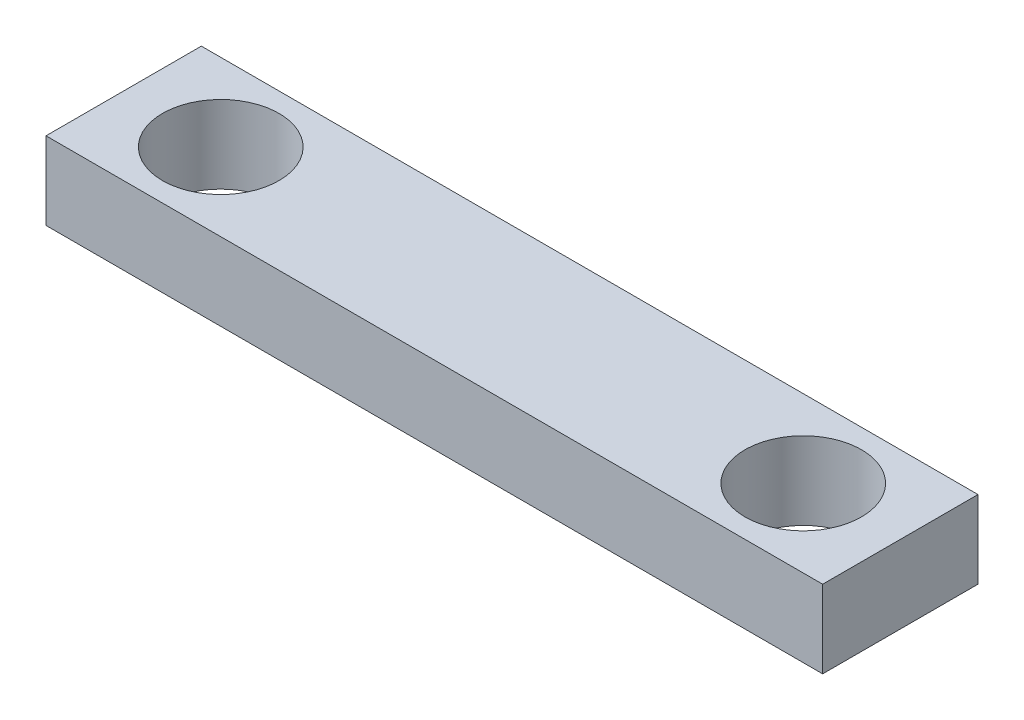
ISO-10303-21;
HEADER;
FILE_DESCRIPTION(('STEP AP214'),'2;1');
FILE_NAME('part.step','',(''),(''),'','','');
FILE_SCHEMA(('AUTOMOTIVE_DESIGN { 1 0 10303 214 1 1 1 1 }'));
ENDSEC;
DATA;
#1=APPLICATION_CONTEXT('core data for automotive mechanical design processes');
#2=APPLICATION_PROTOCOL_DEFINITION('international standard','automotive_design',2000,#1);
#3=PRODUCT_CONTEXT('',#1,'mechanical');
#4=PRODUCT('Part','Part','',(#3));
#5=PRODUCT_RELATED_PRODUCT_CATEGORY('part','',(#4));
#6=PRODUCT_DEFINITION_FORMATION('','',#4);
#7=PRODUCT_DEFINITION_CONTEXT('part definition',#1,'design');
#8=PRODUCT_DEFINITION('design','',#6,#7);
#9=PRODUCT_DEFINITION_SHAPE('','',#8);
#10=(LENGTH_UNIT() NAMED_UNIT(*) SI_UNIT(.MILLI.,.METRE.));
#11=(NAMED_UNIT(*) PLANE_ANGLE_UNIT() SI_UNIT($,.RADIAN.));
#12=(NAMED_UNIT(*) SI_UNIT($,.STERADIAN.) SOLID_ANGLE_UNIT());
#13=UNCERTAINTY_MEASURE_WITH_UNIT(LENGTH_MEASURE(1.E-05),#10,'distance_accuracy_value','');
#14=(GEOMETRIC_REPRESENTATION_CONTEXT(3) GLOBAL_UNCERTAINTY_ASSIGNED_CONTEXT((#13)) GLOBAL_UNIT_ASSIGNED_CONTEXT((#10,
#11,#12)) REPRESENTATION_CONTEXT('',''));
#15=CARTESIAN_POINT('',(0.,0.,0.));
#16=DIRECTION('',(0.,0.,1.));
#17=DIRECTION('',(1.,0.,0.));
#18=AXIS2_PLACEMENT_3D('',#15,#16,#17);
#19=CARTESIAN_POINT('',(0.,2.,0.));
#20=DIRECTION('',(0.,-1.,0.));
#21=DIRECTION('',(0.,0.,-1.));
#22=AXIS2_PLACEMENT_3D('',#19,#20,#21);
#23=PLANE('',#22);
#24=CARTESIAN_POINT('',(-7.5,2.,0.));
#25=DIRECTION('',(0.,1.,0.));
#26=DIRECTION('',(0.,0.,1.));
#27=AXIS2_PLACEMENT_3D('',#24,#25,#26);
#28=CIRCLE('',#27,1.5);
#29=CARTESIAN_POINT('',(-7.5,2.,1.5));
#30=VERTEX_POINT('',#29);
#31=EDGE_CURVE('E102',#30,#30,#28,.T.);
#32=ORIENTED_EDGE('',*,*,#31,.F.);
#33=EDGE_LOOP('',(#32));
#34=FACE_BOUND('',#33,.T.);
#35=DIRECTION('',(0.,0.,-1.));
#36=VECTOR('',#35,1.);
#37=CARTESIAN_POINT('',(10.,2.,2.));
#38=LINE('',#37,#36);
#39=CARTESIAN_POINT('',(10.,2.,2.));
#40=VERTEX_POINT('',#39);
#41=CARTESIAN_POINT('',(10.,2.,-2.));
#42=VERTEX_POINT('',#41);
#43=EDGE_CURVE('E87',#40,#42,#38,.T.);
#44=ORIENTED_EDGE('',*,*,#43,.T.);
#45=DIRECTION('',(-1.,0.,0.));
#46=VECTOR('',#45,1.);
#47=CARTESIAN_POINT('',(-10.,2.,-2.));
#48=LINE('',#47,#46);
#49=CARTESIAN_POINT('',(-10.,2.,-2.));
#50=VERTEX_POINT('',#49);
#51=EDGE_CURVE('E82',#42,#50,#48,.T.);
#52=ORIENTED_EDGE('',*,*,#51,.T.);
#53=DIRECTION('',(0.,0.,1.));
#54=VECTOR('',#53,1.);
#55=CARTESIAN_POINT('',(-10.,2.,2.));
#56=LINE('',#55,#54);
#57=CARTESIAN_POINT('',(-10.,2.,2.));
#58=VERTEX_POINT('',#57);
#59=EDGE_CURVE('E85',#50,#58,#56,.T.);
#60=ORIENTED_EDGE('',*,*,#59,.T.);
#61=DIRECTION('',(1.,0.,0.));
#62=VECTOR('',#61,1.);
#63=CARTESIAN_POINT('',(-10.,2.,2.));
#64=LINE('',#63,#62);
#65=EDGE_CURVE('E52',#58,#40,#64,.T.);
#66=ORIENTED_EDGE('',*,*,#65,.T.);
#67=EDGE_LOOP('',(#44,#52,#60,#66));
#68=FACE_BOUND('',#67,.T.);
#69=CARTESIAN_POINT('',(7.5,2.,0.));
#70=DIRECTION('',(0.,1.,0.));
#71=DIRECTION('',(0.,0.,1.));
#72=AXIS2_PLACEMENT_3D('',#69,#70,#71);
#73=CIRCLE('',#72,1.5);
#74=CARTESIAN_POINT('',(7.5,2.,1.5));
#75=VERTEX_POINT('',#74);
#76=EDGE_CURVE('E117',#75,#75,#73,.T.);
#77=ORIENTED_EDGE('',*,*,#76,.F.);
#78=EDGE_LOOP('',(#77));
#79=FACE_BOUND('',#78,.T.);
#80=ADVANCED_FACE('F35',(#34,#68,#79),#23,.F.);
#81=CARTESIAN_POINT('',(0.,0.,0.));
#82=DIRECTION('',(0.,-1.,0.));
#83=DIRECTION('',(0.,0.,-1.));
#84=AXIS2_PLACEMENT_3D('',#81,#82,#83);
#85=PLANE('',#84);
#86=CARTESIAN_POINT('',(-7.5,0.,0.));
#87=DIRECTION('',(0.,1.,0.));
#88=DIRECTION('',(0.,0.,1.));
#89=AXIS2_PLACEMENT_3D('',#86,#87,#88);
#90=CIRCLE('',#89,1.5);
#91=CARTESIAN_POINT('',(-7.5,0.,1.5));
#92=VERTEX_POINT('',#91);
#93=EDGE_CURVE('E114',#92,#92,#90,.T.);
#94=ORIENTED_EDGE('',*,*,#93,.T.);
#95=EDGE_LOOP('',(#94));
#96=FACE_BOUND('',#95,.T.);
#97=DIRECTION('',(0.,0.,-1.));
#98=VECTOR('',#97,1.);
#99=CARTESIAN_POINT('',(10.,0.,2.));
#100=LINE('',#99,#98);
#101=CARTESIAN_POINT('',(10.,0.,2.));
#102=VERTEX_POINT('',#101);
#103=CARTESIAN_POINT('',(10.,0.,-2.));
#104=VERTEX_POINT('',#103);
#105=EDGE_CURVE('E99',#102,#104,#100,.T.);
#106=ORIENTED_EDGE('',*,*,#105,.F.);
#107=DIRECTION('',(1.,0.,0.));
#108=VECTOR('',#107,1.);
#109=CARTESIAN_POINT('',(-10.,0.,2.));
#110=LINE('',#109,#108);
#111=CARTESIAN_POINT('',(-10.,0.,2.));
#112=VERTEX_POINT('',#111);
#113=EDGE_CURVE('E75',#112,#102,#110,.T.);
#114=ORIENTED_EDGE('',*,*,#113,.F.);
#115=DIRECTION('',(0.,0.,1.));
#116=VECTOR('',#115,1.);
#117=CARTESIAN_POINT('',(-10.,0.,2.));
#118=LINE('',#117,#116);
#119=CARTESIAN_POINT('',(-10.,0.,-2.));
#120=VERTEX_POINT('',#119);
#121=EDGE_CURVE('E69',#120,#112,#118,.T.);
#122=ORIENTED_EDGE('',*,*,#121,.F.);
#123=DIRECTION('',(-1.,0.,0.));
#124=VECTOR('',#123,1.);
#125=CARTESIAN_POINT('',(-10.,0.,-2.));
#126=LINE('',#125,#124);
#127=EDGE_CURVE('E91',#104,#120,#126,.T.);
#128=ORIENTED_EDGE('',*,*,#127,.F.);
#129=EDGE_LOOP('',(#106,#114,#122,#128));
#130=FACE_BOUND('',#129,.T.);
#131=CARTESIAN_POINT('',(7.5,0.,0.));
#132=DIRECTION('',(0.,1.,0.));
#133=DIRECTION('',(0.,0.,1.));
#134=AXIS2_PLACEMENT_3D('',#131,#132,#133);
#135=CIRCLE('',#134,1.5);
#136=CARTESIAN_POINT('',(7.5,0.,1.5));
#137=VERTEX_POINT('',#136);
#138=EDGE_CURVE('E120',#137,#137,#135,.T.);
#139=ORIENTED_EDGE('',*,*,#138,.T.);
#140=EDGE_LOOP('',(#139));
#141=FACE_BOUND('',#140,.T.);
#142=ADVANCED_FACE('F110',(#96,#130,#141),#85,.T.);
#143=CARTESIAN_POINT('',(10.,2.,2.));
#144=DIRECTION('',(-1.,0.,0.));
#145=DIRECTION('',(0.,0.,1.));
#146=AXIS2_PLACEMENT_3D('',#143,#144,#145);
#147=PLANE('',#146);
#148=ORIENTED_EDGE('',*,*,#105,.T.);
#149=DIRECTION('',(0.,-1.,0.));
#150=VECTOR('',#149,1.);
#151=CARTESIAN_POINT('',(10.,2.,-2.));
#152=LINE('',#151,#150);
#153=EDGE_CURVE('E11',#42,#104,#152,.T.);
#154=ORIENTED_EDGE('',*,*,#153,.F.);
#155=ORIENTED_EDGE('',*,*,#43,.F.);
#156=DIRECTION('',(0.,-1.,0.));
#157=VECTOR('',#156,1.);
#158=CARTESIAN_POINT('',(10.,2.,2.));
#159=LINE('',#158,#157);
#160=EDGE_CURVE('E95',#40,#102,#159,.T.);
#161=ORIENTED_EDGE('',*,*,#160,.T.);
#162=EDGE_LOOP('',(#148,#154,#155,#161));
#163=FACE_BOUND('',#162,.T.);
#164=ADVANCED_FACE('F37',(#163),#147,.F.);
#165=CARTESIAN_POINT('',(-10.,2.,-2.));
#166=DIRECTION('',(0.,0.,1.));
#167=DIRECTION('',(1.,0.,0.));
#168=AXIS2_PLACEMENT_3D('',#165,#166,#167);
#169=PLANE('',#168);
#170=ORIENTED_EDGE('',*,*,#127,.T.);
#171=DIRECTION('',(0.,-1.,0.));
#172=VECTOR('',#171,1.);
#173=CARTESIAN_POINT('',(-10.,2.,-2.));
#174=LINE('',#173,#172);
#175=EDGE_CURVE('E44',#50,#120,#174,.T.);
#176=ORIENTED_EDGE('',*,*,#175,.F.);
#177=ORIENTED_EDGE('',*,*,#51,.F.);
#178=ORIENTED_EDGE('',*,*,#153,.T.);
#179=EDGE_LOOP('',(#170,#176,#177,#178));
#180=FACE_BOUND('',#179,.T.);
#181=ADVANCED_FACE('F90',(#180),#169,.F.);
#182=CARTESIAN_POINT('',(-10.,2.,2.));
#183=DIRECTION('',(1.,0.,0.));
#184=DIRECTION('',(0.,0.,-1.));
#185=AXIS2_PLACEMENT_3D('',#182,#183,#184);
#186=PLANE('',#185);
#187=ORIENTED_EDGE('',*,*,#121,.T.);
#188=DIRECTION('',(0.,-1.,0.));
#189=VECTOR('',#188,1.);
#190=CARTESIAN_POINT('',(-10.,2.,2.));
#191=LINE('',#190,#189);
#192=EDGE_CURVE('E92',#58,#112,#191,.T.);
#193=ORIENTED_EDGE('',*,*,#192,.F.);
#194=ORIENTED_EDGE('',*,*,#59,.F.);
#195=ORIENTED_EDGE('',*,*,#175,.T.);
#196=EDGE_LOOP('',(#187,#193,#194,#195));
#197=FACE_BOUND('',#196,.T.);
#198=ADVANCED_FACE('F93',(#197),#186,.F.);
#199=CARTESIAN_POINT('',(-10.,2.,2.));
#200=DIRECTION('',(0.,0.,-1.));
#201=DIRECTION('',(-1.,0.,0.));
#202=AXIS2_PLACEMENT_3D('',#199,#200,#201);
#203=PLANE('',#202);
#204=ORIENTED_EDGE('',*,*,#113,.T.);
#205=ORIENTED_EDGE('',*,*,#160,.F.);
#206=ORIENTED_EDGE('',*,*,#65,.F.);
#207=ORIENTED_EDGE('',*,*,#192,.T.);
#208=EDGE_LOOP('',(#204,#205,#206,#207));
#209=FACE_BOUND('',#208,.T.);
#210=ADVANCED_FACE('F107',(#209),#203,.F.);
#211=CARTESIAN_POINT('',(-7.5,2.,0.));
#212=DIRECTION('',(0.,-1.,0.));
#213=DIRECTION('',(0.,0.,-1.));
#214=AXIS2_PLACEMENT_3D('',#211,#212,#213);
#215=CYLINDRICAL_SURFACE('',#214,1.5);
#216=ORIENTED_EDGE('',*,*,#31,.T.);
#217=EDGE_LOOP('',(#216));
#218=FACE_BOUND('',#217,.T.);
#219=ORIENTED_EDGE('',*,*,#93,.F.);
#220=EDGE_LOOP('',(#219));
#221=FACE_BOUND('',#220,.T.);
#222=ADVANCED_FACE('F138',(#218,#221),#215,.F.);
#223=CARTESIAN_POINT('',(7.5,2.,0.));
#224=DIRECTION('',(0.,-1.,0.));
#225=DIRECTION('',(0.,0.,-1.));
#226=AXIS2_PLACEMENT_3D('',#223,#224,#225);
#227=CYLINDRICAL_SURFACE('',#226,1.5);
#228=ORIENTED_EDGE('',*,*,#76,.T.);
#229=EDGE_LOOP('',(#228));
#230=FACE_BOUND('',#229,.T.);
#231=ORIENTED_EDGE('',*,*,#138,.F.);
#232=EDGE_LOOP('',(#231));
#233=FACE_BOUND('',#232,.T.);
#234=ADVANCED_FACE('F126',(#230,#233),#227,.F.);
#235=CLOSED_SHELL('',(#80,#142,#164,#181,#198,#210,#222,#234));
#236=MANIFOLD_SOLID_BREP('B2',#235);
#237=ADVANCED_BREP_SHAPE_REPRESENTATION('',(#18,#236),#14);
#238=SHAPE_DEFINITION_REPRESENTATION(#9,#237);
ENDSEC;
END-ISO-10303-21;
